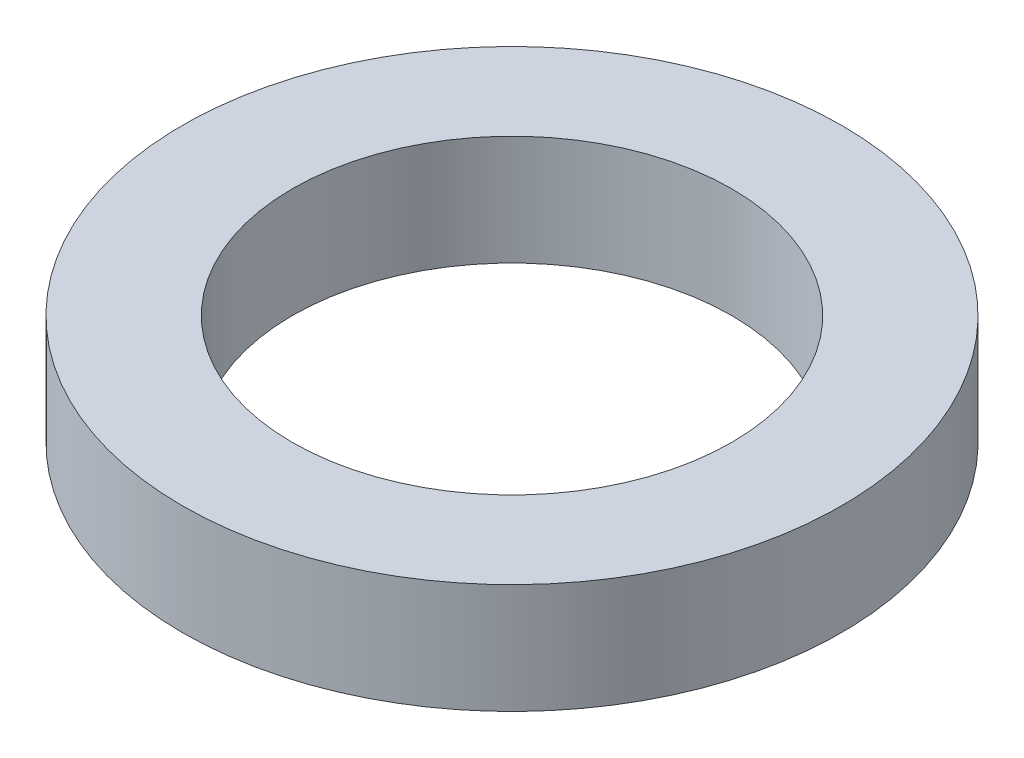
ISO-10303-21;
HEADER;
FILE_DESCRIPTION(('STEP AP214'),'2;1');
FILE_NAME('part.step','',(''),(''),'','','');
FILE_SCHEMA(('AUTOMOTIVE_DESIGN { 1 0 10303 214 1 1 1 1 }'));
ENDSEC;
DATA;
#1=APPLICATION_CONTEXT('core data for automotive mechanical design processes');
#2=APPLICATION_PROTOCOL_DEFINITION('international standard','automotive_design',2000,#1);
#3=PRODUCT_CONTEXT('',#1,'mechanical');
#4=PRODUCT('Part','Part','',(#3));
#5=PRODUCT_RELATED_PRODUCT_CATEGORY('part','',(#4));
#6=PRODUCT_DEFINITION_FORMATION('','',#4);
#7=PRODUCT_DEFINITION_CONTEXT('part definition',#1,'design');
#8=PRODUCT_DEFINITION('design','',#6,#7);
#9=PRODUCT_DEFINITION_SHAPE('','',#8);
#10=(LENGTH_UNIT() NAMED_UNIT(*) SI_UNIT(.MILLI.,.METRE.));
#11=(NAMED_UNIT(*) PLANE_ANGLE_UNIT() SI_UNIT($,.RADIAN.));
#12=(NAMED_UNIT(*) SI_UNIT($,.STERADIAN.) SOLID_ANGLE_UNIT());
#13=UNCERTAINTY_MEASURE_WITH_UNIT(LENGTH_MEASURE(1.E-05),#10,'distance_accuracy_value','');
#14=(GEOMETRIC_REPRESENTATION_CONTEXT(3) GLOBAL_UNCERTAINTY_ASSIGNED_CONTEXT((#13)) GLOBAL_UNIT_ASSIGNED_CONTEXT((#10,
#11,#12)) REPRESENTATION_CONTEXT('',''));
#15=CARTESIAN_POINT('',(0.,0.,0.));
#16=DIRECTION('',(0.,0.,1.));
#17=DIRECTION('',(1.,0.,0.));
#18=AXIS2_PLACEMENT_3D('',#15,#16,#17);
#19=CARTESIAN_POINT('',(0.,0.,0.));
#20=DIRECTION('',(0.,1.,0.));
#21=DIRECTION('',(0.,0.,1.));
#22=AXIS2_PLACEMENT_3D('',#19,#20,#21);
#23=CYLINDRICAL_SURFACE('',#22,3.175);
#24=CARTESIAN_POINT('',(0.,0.,0.));
#25=DIRECTION('',(0.,1.,0.));
#26=DIRECTION('',(0.,0.,1.));
#27=AXIS2_PLACEMENT_3D('',#24,#25,#26);
#28=CIRCLE('',#27,3.175);
#29=CARTESIAN_POINT('',(0.,0.,3.175));
#30=VERTEX_POINT('',#29);
#31=EDGE_CURVE('E27',#30,#30,#28,.F.);
#32=ORIENTED_EDGE('',*,*,#31,.T.);
#33=EDGE_LOOP('',(#32));
#34=FACE_BOUND('',#33,.T.);
#35=CARTESIAN_POINT('',(0.,1.5875,0.));
#36=DIRECTION('',(0.,1.,0.));
#37=DIRECTION('',(0.,0.,1.));
#38=AXIS2_PLACEMENT_3D('',#35,#36,#37);
#39=CIRCLE('',#38,3.175);
#40=CARTESIAN_POINT('',(0.,1.5875,3.175));
#41=VERTEX_POINT('',#40);
#42=EDGE_CURVE('E18',#41,#41,#39,.F.);
#43=ORIENTED_EDGE('',*,*,#42,.F.);
#44=EDGE_LOOP('',(#43));
#45=FACE_BOUND('',#44,.T.);
#46=ADVANCED_FACE('F15',(#34,#45),#23,.F.);
#47=CARTESIAN_POINT('',(0.,1.5875,0.));
#48=DIRECTION('',(0.,1.,0.));
#49=DIRECTION('',(0.,0.,1.));
#50=AXIS2_PLACEMENT_3D('',#47,#48,#49);
#51=PLANE('',#50);
#52=ORIENTED_EDGE('',*,*,#42,.T.);
#53=EDGE_LOOP('',(#52));
#54=FACE_BOUND('',#53,.T.);
#55=CARTESIAN_POINT('',(0.,1.5875,0.));
#56=DIRECTION('',(0.,1.,0.));
#57=DIRECTION('',(0.,0.,1.));
#58=AXIS2_PLACEMENT_3D('',#55,#56,#57);
#59=CIRCLE('',#58,4.7625);
#60=CARTESIAN_POINT('',(0.,1.5875,4.7625));
#61=VERTEX_POINT('',#60);
#62=EDGE_CURVE('E22',#61,#61,#59,.F.);
#63=ORIENTED_EDGE('',*,*,#62,.F.);
#64=EDGE_LOOP('',(#63));
#65=FACE_BOUND('',#64,.T.);
#66=ADVANCED_FACE('F35',(#54,#65),#51,.T.);
#67=CARTESIAN_POINT('',(0.,0.,0.));
#68=DIRECTION('',(0.,1.,0.));
#69=DIRECTION('',(0.,0.,1.));
#70=AXIS2_PLACEMENT_3D('',#67,#68,#69);
#71=PLANE('',#70);
#72=ORIENTED_EDGE('',*,*,#31,.F.);
#73=EDGE_LOOP('',(#72));
#74=FACE_BOUND('',#73,.T.);
#75=CARTESIAN_POINT('',(0.,0.,0.));
#76=DIRECTION('',(0.,1.,0.));
#77=DIRECTION('',(0.,0.,1.));
#78=AXIS2_PLACEMENT_3D('',#75,#76,#77);
#79=CIRCLE('',#78,4.7625);
#80=CARTESIAN_POINT('',(0.,0.,4.7625));
#81=VERTEX_POINT('',#80);
#82=EDGE_CURVE('E10',#81,#81,#79,.T.);
#83=ORIENTED_EDGE('',*,*,#82,.F.);
#84=EDGE_LOOP('',(#83));
#85=FACE_BOUND('',#84,.T.);
#86=ADVANCED_FACE('F43',(#74,#85),#71,.F.);
#87=CARTESIAN_POINT('',(0.,0.,0.));
#88=DIRECTION('',(0.,1.,0.));
#89=DIRECTION('',(0.,0.,1.));
#90=AXIS2_PLACEMENT_3D('',#87,#88,#89);
#91=CYLINDRICAL_SURFACE('',#90,4.7625);
#92=ORIENTED_EDGE('',*,*,#82,.T.);
#93=EDGE_LOOP('',(#92));
#94=FACE_BOUND('',#93,.T.);
#95=ORIENTED_EDGE('',*,*,#62,.T.);
#96=EDGE_LOOP('',(#95));
#97=FACE_BOUND('',#96,.T.);
#98=ADVANCED_FACE('F44',(#94,#97),#91,.T.);
#99=CLOSED_SHELL('',(#46,#66,#86,#98));
#100=MANIFOLD_SOLID_BREP('B1',#99);
#101=ADVANCED_BREP_SHAPE_REPRESENTATION('',(#18,#100),#14);
#102=SHAPE_DEFINITION_REPRESENTATION(#9,#101);
ENDSEC;
END-ISO-10303-21;
